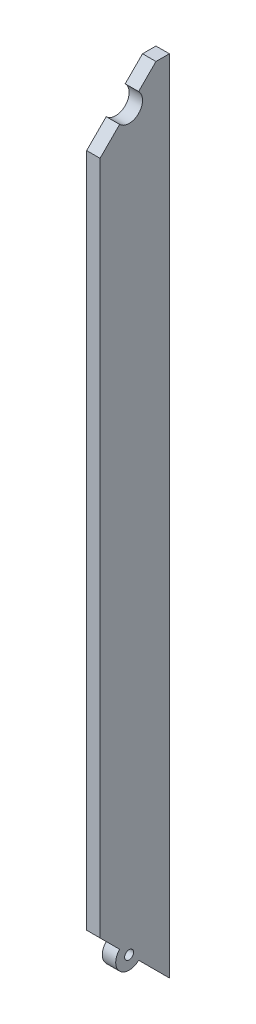
ISO-10303-21;
HEADER;
FILE_DESCRIPTION(('STEP AP214'),'2;1');
FILE_NAME('part.step','',(''),(''),'','','');
FILE_SCHEMA(('AUTOMOTIVE_DESIGN { 1 0 10303 214 1 1 1 1 }'));
ENDSEC;
DATA;
#1=APPLICATION_CONTEXT('core data for automotive mechanical design processes');
#2=APPLICATION_PROTOCOL_DEFINITION('international standard','automotive_design',2000,#1);
#3=PRODUCT_CONTEXT('',#1,'mechanical');
#4=PRODUCT('Part','Part','',(#3));
#5=PRODUCT_RELATED_PRODUCT_CATEGORY('part','',(#4));
#6=PRODUCT_DEFINITION_FORMATION('','',#4);
#7=PRODUCT_DEFINITION_CONTEXT('part definition',#1,'design');
#8=PRODUCT_DEFINITION('design','',#6,#7);
#9=PRODUCT_DEFINITION_SHAPE('','',#8);
#10=(LENGTH_UNIT() NAMED_UNIT(*) SI_UNIT(.MILLI.,.METRE.));
#11=(NAMED_UNIT(*) PLANE_ANGLE_UNIT() SI_UNIT($,.RADIAN.));
#12=(NAMED_UNIT(*) SI_UNIT($,.STERADIAN.) SOLID_ANGLE_UNIT());
#13=UNCERTAINTY_MEASURE_WITH_UNIT(LENGTH_MEASURE(1.E-05),#10,'distance_accuracy_value','');
#14=(GEOMETRIC_REPRESENTATION_CONTEXT(3) GLOBAL_UNCERTAINTY_ASSIGNED_CONTEXT((#13)) GLOBAL_UNIT_ASSIGNED_CONTEXT((#10,
#11,#12)) REPRESENTATION_CONTEXT('',''));
#15=CARTESIAN_POINT('',(0.,0.,0.));
#16=DIRECTION('',(0.,0.,1.));
#17=DIRECTION('',(1.,0.,0.));
#18=AXIS2_PLACEMENT_3D('',#15,#16,#17);
#19=CARTESIAN_POINT('',(6.,175.999999999998,176.));
#20=DIRECTION('',(0.,0.707106781186544,0.707106781186551));
#21=DIRECTION('',(0.,-0.707106781186551,0.707106781186544));
#22=AXIS2_PLACEMENT_3D('',#19,#20,#21);
#23=PLANE('',#22);
#24=DIRECTION('',(1.,0.,0.));
#25=VECTOR('',#24,1.);
#26=CARTESIAN_POINT('',(0.,335.75735931288,16.2426406871193));
#27=LINE('',#26,#25);
#28=CARTESIAN_POINT('',(0.,335.75735931288,16.2426406871193));
#29=VERTEX_POINT('',#28);
#30=CARTESIAN_POINT('',(6.,335.75735931288,16.2426406871193));
#31=VERTEX_POINT('',#30);
#32=EDGE_CURVE('E113',#29,#31,#27,.T.);
#33=ORIENTED_EDGE('',*,*,#32,.F.);
#34=DIRECTION('',(0.,0.707106781186552,-0.707106781186544));
#35=VECTOR('',#34,1.);
#36=CARTESIAN_POINT('',(0.,175.999999999998,176.));
#37=LINE('',#36,#35);
#38=CARTESIAN_POINT('',(0.,327.,25.));
#39=VERTEX_POINT('',#38);
#40=EDGE_CURVE('E117',#39,#29,#37,.T.);
#41=ORIENTED_EDGE('',*,*,#40,.F.);
#42=DIRECTION('',(-1.,0.,0.));
#43=VECTOR('',#42,1.);
#44=CARTESIAN_POINT('',(6.,327.,25.));
#45=LINE('',#44,#43);
#46=CARTESIAN_POINT('',(6.,327.,25.));
#47=VERTEX_POINT('',#46);
#48=EDGE_CURVE('E140',#47,#39,#45,.T.);
#49=ORIENTED_EDGE('',*,*,#48,.F.);
#50=DIRECTION('',(0.,0.707106781186552,-0.707106781186544));
#51=VECTOR('',#50,1.);
#52=CARTESIAN_POINT('',(6.,175.999999999998,176.));
#53=LINE('',#52,#51);
#54=EDGE_CURVE('E121',#47,#31,#53,.T.);
#55=ORIENTED_EDGE('',*,*,#54,.T.);
#56=EDGE_LOOP('',(#33,#41,#49,#55));
#57=FACE_BOUND('',#56,.T.);
#58=ADVANCED_FACE('F41',(#57),#23,.T.);
#59=CARTESIAN_POINT('',(6.,0.,0.));
#60=DIRECTION('',(0.,0.707106781186549,-0.707106781186546));
#61=DIRECTION('',(0.,0.707106781186546,0.707106781186549));
#62=AXIS2_PLACEMENT_3D('',#59,#60,#61);
#63=PLANE('',#62);
#64=DIRECTION('',(0.,-0.707106781186546,-0.707106781186549));
#65=VECTOR('',#64,1.);
#66=CARTESIAN_POINT('',(0.,0.,0.));
#67=LINE('',#66,#65);
#68=CARTESIAN_POINT('',(0.,24.9999999999999,25.));
#69=VERTEX_POINT('',#68);
#70=CARTESIAN_POINT('',(0.,16.2426406871192,16.2426406871193));
#71=VERTEX_POINT('',#70);
#72=EDGE_CURVE('E146',#69,#71,#67,.T.);
#73=ORIENTED_EDGE('',*,*,#72,.T.);
#74=DIRECTION('',(1.,0.,0.));
#75=VECTOR('',#74,1.);
#76=CARTESIAN_POINT('',(-16.9705627484771,16.2426406871193,16.2426406871193));
#77=LINE('',#76,#75);
#78=CARTESIAN_POINT('',(6.,16.2426406871192,16.2426406871193));
#79=VERTEX_POINT('',#78);
#80=EDGE_CURVE('E161',#71,#79,#77,.T.);
#81=ORIENTED_EDGE('',*,*,#80,.T.);
#82=DIRECTION('',(0.,-0.707106781186546,-0.707106781186549));
#83=VECTOR('',#82,1.);
#84=CARTESIAN_POINT('',(6.,0.,0.));
#85=LINE('',#84,#83);
#86=CARTESIAN_POINT('',(6.,24.9999999999999,25.));
#87=VERTEX_POINT('',#86);
#88=EDGE_CURVE('E154',#87,#79,#85,.T.);
#89=ORIENTED_EDGE('',*,*,#88,.F.);
#90=DIRECTION('',(-1.,0.,0.));
#91=VECTOR('',#90,1.);
#92=CARTESIAN_POINT('',(6.,24.9999999999999,25.));
#93=LINE('',#92,#91);
#94=EDGE_CURVE('E47',#87,#69,#93,.T.);
#95=ORIENTED_EDGE('',*,*,#94,.T.);
#96=EDGE_LOOP('',(#73,#81,#89,#95));
#97=FACE_BOUND('',#96,.T.);
#98=ADVANCED_FACE('F149',(#97),#63,.F.);
#99=CARTESIAN_POINT('',(6.,0.,25.));
#100=DIRECTION('',(0.,0.,1.));
#101=DIRECTION('',(0.,-1.,0.));
#102=AXIS2_PLACEMENT_3D('',#99,#100,#101);
#103=PLANE('',#102);
#104=DIRECTION('',(0.,1.,0.));
#105=VECTOR('',#104,1.);
#106=CARTESIAN_POINT('',(0.,0.,25.));
#107=LINE('',#106,#105);
#108=EDGE_CURVE('E127',#69,#39,#107,.T.);
#109=ORIENTED_EDGE('',*,*,#108,.F.);
#110=ORIENTED_EDGE('',*,*,#94,.F.);
#111=DIRECTION('',(0.,1.,0.));
#112=VECTOR('',#111,1.);
#113=CARTESIAN_POINT('',(6.,0.,25.));
#114=LINE('',#113,#112);
#115=EDGE_CURVE('E128',#87,#47,#114,.T.);
#116=ORIENTED_EDGE('',*,*,#115,.T.);
#117=ORIENTED_EDGE('',*,*,#48,.T.);
#118=EDGE_LOOP('',(#109,#110,#116,#117));
#119=FACE_BOUND('',#118,.T.);
#120=ADVANCED_FACE('F43',(#119),#103,.T.);
#121=CARTESIAN_POINT('',(6.,7.75735931288069,7.75735931288073));
#122=VERTEX_POINT('',#121);
#123=CARTESIAN_POINT('',(6.,-6.00000000000002,-6.00000000000004));
#124=VERTEX_POINT('',#123);
#125=EDGE_CURVE('E65',#122,#124,#85,.T.);
#126=ORIENTED_EDGE('',*,*,#125,.F.);
#127=DIRECTION('',(1.,0.,0.));
#128=VECTOR('',#127,1.);
#129=CARTESIAN_POINT('',(-16.9705627484771,7.7573593128807,7.75735931288073));
#130=LINE('',#129,#128);
#131=CARTESIAN_POINT('',(0.,7.75735931288069,7.75735931288073));
#132=VERTEX_POINT('',#131);
#133=EDGE_CURVE('E163',#122,#132,#130,.F.);
#134=ORIENTED_EDGE('',*,*,#133,.T.);
#135=CARTESIAN_POINT('',(0.,-6.00000000000002,-6.00000000000004));
#136=VERTEX_POINT('',#135);
#137=EDGE_CURVE('E158',#132,#136,#67,.T.);
#138=ORIENTED_EDGE('',*,*,#137,.T.);
#139=DIRECTION('',(-1.,0.,0.));
#140=VECTOR('',#139,1.);
#141=CARTESIAN_POINT('',(6.,-6.00000000000002,-6.00000000000004));
#142=LINE('',#141,#140);
#143=EDGE_CURVE('E145',#124,#136,#142,.T.);
#144=ORIENTED_EDGE('',*,*,#143,.F.);
#145=EDGE_LOOP('',(#126,#134,#138,#144));
#146=FACE_BOUND('',#145,.T.);
#147=ADVANCED_FACE('F181',(#146),#63,.F.);
#148=CARTESIAN_POINT('',(6.,0.,-6.00000000000004));
#149=DIRECTION('',(0.,0.,-1.));
#150=DIRECTION('',(0.,1.,0.));
#151=AXIS2_PLACEMENT_3D('',#148,#149,#150);
#152=PLANE('',#151);
#153=DIRECTION('',(0.,-1.,0.));
#154=VECTOR('',#153,1.);
#155=CARTESIAN_POINT('',(0.,0.,-6.00000000000004));
#156=LINE('',#155,#154);
#157=CARTESIAN_POINT('',(0.,352.,-6.));
#158=VERTEX_POINT('',#157);
#159=EDGE_CURVE('E159',#158,#136,#156,.T.);
#160=ORIENTED_EDGE('',*,*,#159,.F.);
#161=DIRECTION('',(-1.,0.,0.));
#162=VECTOR('',#161,1.);
#163=CARTESIAN_POINT('',(6.,352.,-6.));
#164=LINE('',#163,#162);
#165=CARTESIAN_POINT('',(6.,352.,-6.));
#166=VERTEX_POINT('',#165);
#167=EDGE_CURVE('E144',#166,#158,#164,.T.);
#168=ORIENTED_EDGE('',*,*,#167,.F.);
#169=DIRECTION('',(0.,-1.,0.));
#170=VECTOR('',#169,1.);
#171=CARTESIAN_POINT('',(6.,0.,-6.00000000000004));
#172=LINE('',#171,#170);
#173=EDGE_CURVE('E182',#166,#124,#172,.T.);
#174=ORIENTED_EDGE('',*,*,#173,.T.);
#175=ORIENTED_EDGE('',*,*,#143,.T.);
#176=EDGE_LOOP('',(#160,#168,#174,#175));
#177=FACE_BOUND('',#176,.T.);
#178=ADVANCED_FACE('F183',(#177),#152,.T.);
#179=CARTESIAN_POINT('',(6.,352.,0.));
#180=DIRECTION('',(0.,1.,0.));
#181=DIRECTION('',(0.,0.,1.));
#182=AXIS2_PLACEMENT_3D('',#179,#180,#181);
#183=PLANE('',#182);
#184=DIRECTION('',(0.,0.,-1.));
#185=VECTOR('',#184,1.);
#186=CARTESIAN_POINT('',(0.,352.,0.));
#187=LINE('',#186,#185);
#188=CARTESIAN_POINT('',(0.,352.,0.));
#189=VERTEX_POINT('',#188);
#190=EDGE_CURVE('E131',#189,#158,#187,.T.);
#191=ORIENTED_EDGE('',*,*,#190,.F.);
#192=DIRECTION('',(-1.,0.,0.));
#193=VECTOR('',#192,1.);
#194=CARTESIAN_POINT('',(6.,352.,0.));
#195=LINE('',#194,#193);
#196=CARTESIAN_POINT('',(6.,352.,0.));
#197=VERTEX_POINT('',#196);
#198=EDGE_CURVE('E137',#197,#189,#195,.T.);
#199=ORIENTED_EDGE('',*,*,#198,.F.);
#200=DIRECTION('',(0.,0.,-1.));
#201=VECTOR('',#200,1.);
#202=CARTESIAN_POINT('',(6.,352.,0.));
#203=LINE('',#202,#201);
#204=EDGE_CURVE('E177',#197,#166,#203,.T.);
#205=ORIENTED_EDGE('',*,*,#204,.T.);
#206=ORIENTED_EDGE('',*,*,#167,.T.);
#207=EDGE_LOOP('',(#191,#199,#205,#206));
#208=FACE_BOUND('',#207,.T.);
#209=ADVANCED_FACE('F174',(#208),#183,.T.);
#210=DIRECTION('',(1.,0.,0.));
#211=VECTOR('',#210,1.);
#212=CARTESIAN_POINT('',(0.,344.242640687119,7.75735931288075));
#213=LINE('',#212,#211);
#214=CARTESIAN_POINT('',(6.,344.242640687119,7.75735931288079));
#215=VERTEX_POINT('',#214);
#216=CARTESIAN_POINT('',(0.,344.242640687119,7.75735931288076));
#217=VERTEX_POINT('',#216);
#218=EDGE_CURVE('E57',#215,#217,#213,.F.);
#219=ORIENTED_EDGE('',*,*,#218,.F.);
#220=EDGE_CURVE('E193',#215,#197,#53,.T.);
#221=ORIENTED_EDGE('',*,*,#220,.T.);
#222=ORIENTED_EDGE('',*,*,#198,.T.);
#223=EDGE_CURVE('E129',#217,#189,#37,.T.);
#224=ORIENTED_EDGE('',*,*,#223,.F.);
#225=EDGE_LOOP('',(#219,#221,#222,#224));
#226=FACE_BOUND('',#225,.T.);
#227=ADVANCED_FACE('F196',(#226),#23,.T.);
#228=CARTESIAN_POINT('',(6.,0.,0.));
#229=DIRECTION('',(1.,0.,0.));
#230=DIRECTION('',(0.,0.,-1.));
#231=AXIS2_PLACEMENT_3D('',#228,#229,#230);
#232=PLANE('',#231);
#233=CARTESIAN_POINT('',(6.,340.,12.));
#234=DIRECTION('',(1.,0.,0.));
#235=DIRECTION('',(0.,0.,-1.));
#236=AXIS2_PLACEMENT_3D('',#233,#234,#235);
#237=CIRCLE('',#236,6.00000000000001);
#238=EDGE_CURVE('E199',#31,#215,#237,.T.);
#239=ORIENTED_EDGE('',*,*,#238,.F.);
#240=ORIENTED_EDGE('',*,*,#54,.F.);
#241=ORIENTED_EDGE('',*,*,#115,.F.);
#242=ORIENTED_EDGE('',*,*,#88,.T.);
#243=CARTESIAN_POINT('',(6.,12.,12.));
#244=DIRECTION('',(1.,0.,0.));
#245=DIRECTION('',(0.,0.,-1.));
#246=AXIS2_PLACEMENT_3D('',#243,#244,#245);
#247=CIRCLE('',#246,6.);
#248=EDGE_CURVE('E125',#79,#122,#247,.T.);
#249=ORIENTED_EDGE('',*,*,#248,.T.);
#250=ORIENTED_EDGE('',*,*,#125,.T.);
#251=ORIENTED_EDGE('',*,*,#173,.F.);
#252=ORIENTED_EDGE('',*,*,#204,.F.);
#253=ORIENTED_EDGE('',*,*,#220,.F.);
#254=EDGE_LOOP('',(#239,#240,#241,#242,#249,#250,#251,#252,#253));
#255=FACE_BOUND('',#254,.T.);
#256=CARTESIAN_POINT('',(6.,12.,12.));
#257=DIRECTION('',(1.,0.,0.));
#258=DIRECTION('',(0.,0.,-1.));
#259=AXIS2_PLACEMENT_3D('',#256,#257,#258);
#260=CIRCLE('',#259,2.);
#261=CARTESIAN_POINT('',(6.,12.,10.));
#262=VERTEX_POINT('',#261);
#263=EDGE_CURVE('E201',#262,#262,#260,.T.);
#264=ORIENTED_EDGE('',*,*,#263,.F.);
#265=EDGE_LOOP('',(#264));
#266=FACE_BOUND('',#265,.T.);
#267=ADVANCED_FACE('F198',(#255,#266),#232,.T.);
#268=CARTESIAN_POINT('',(0.,0.,0.));
#269=DIRECTION('',(1.,0.,0.));
#270=DIRECTION('',(0.,0.,-1.));
#271=AXIS2_PLACEMENT_3D('',#268,#269,#270);
#272=PLANE('',#271);
#273=CARTESIAN_POINT('',(0.,12.,12.));
#274=DIRECTION('',(1.,0.,0.));
#275=DIRECTION('',(0.,0.,-1.));
#276=AXIS2_PLACEMENT_3D('',#273,#274,#275);
#277=CIRCLE('',#276,2.);
#278=CARTESIAN_POINT('',(0.,12.,10.));
#279=VERTEX_POINT('',#278);
#280=EDGE_CURVE('E204',#279,#279,#277,.T.);
#281=ORIENTED_EDGE('',*,*,#280,.T.);
#282=EDGE_LOOP('',(#281));
#283=FACE_BOUND('',#282,.T.);
#284=ORIENTED_EDGE('',*,*,#40,.T.);
#285=CARTESIAN_POINT('',(0.,340.,12.));
#286=DIRECTION('',(1.,0.,0.));
#287=DIRECTION('',(0.,0.,-1.));
#288=AXIS2_PLACEMENT_3D('',#285,#286,#287);
#289=CIRCLE('',#288,6.00000000000001);
#290=EDGE_CURVE('E11',#29,#217,#289,.T.);
#291=ORIENTED_EDGE('',*,*,#290,.T.);
#292=ORIENTED_EDGE('',*,*,#223,.T.);
#293=ORIENTED_EDGE('',*,*,#190,.T.);
#294=ORIENTED_EDGE('',*,*,#159,.T.);
#295=ORIENTED_EDGE('',*,*,#137,.F.);
#296=CARTESIAN_POINT('',(0.,12.,12.));
#297=DIRECTION('',(1.,0.,0.));
#298=DIRECTION('',(0.,0.,-1.));
#299=AXIS2_PLACEMENT_3D('',#296,#297,#298);
#300=CIRCLE('',#299,6.);
#301=EDGE_CURVE('E156',#132,#71,#300,.F.);
#302=ORIENTED_EDGE('',*,*,#301,.T.);
#303=ORIENTED_EDGE('',*,*,#72,.F.);
#304=ORIENTED_EDGE('',*,*,#108,.T.);
#305=EDGE_LOOP('',(#284,#291,#292,#293,#294,#295,#302,#303,#304));
#306=FACE_BOUND('',#305,.T.);
#307=ADVANCED_FACE('F124',(#283,#306),#272,.F.);
#308=CARTESIAN_POINT('',(-16.9705627484771,12.,12.));
#309=DIRECTION('',(1.,0.,0.));
#310=DIRECTION('',(0.,0.,-1.));
#311=AXIS2_PLACEMENT_3D('',#308,#309,#310);
#312=CYLINDRICAL_SURFACE('',#311,6.);
#313=ORIENTED_EDGE('',*,*,#80,.F.);
#314=ORIENTED_EDGE('',*,*,#301,.F.);
#315=ORIENTED_EDGE('',*,*,#133,.F.);
#316=ORIENTED_EDGE('',*,*,#248,.F.);
#317=EDGE_LOOP('',(#313,#314,#315,#316));
#318=FACE_BOUND('',#317,.T.);
#319=ADVANCED_FACE('F186',(#318),#312,.T.);
#320=CARTESIAN_POINT('',(0.,12.,12.));
#321=DIRECTION('',(1.,0.,0.));
#322=DIRECTION('',(0.,0.,-1.));
#323=AXIS2_PLACEMENT_3D('',#320,#321,#322);
#324=CYLINDRICAL_SURFACE('',#323,2.);
#325=ORIENTED_EDGE('',*,*,#280,.F.);
#326=EDGE_LOOP('',(#325));
#327=FACE_BOUND('',#326,.T.);
#328=ORIENTED_EDGE('',*,*,#263,.T.);
#329=EDGE_LOOP('',(#328));
#330=FACE_BOUND('',#329,.T.);
#331=ADVANCED_FACE('F211',(#327,#330),#324,.F.);
#332=CARTESIAN_POINT('',(0.,340.,12.));
#333=DIRECTION('',(1.,0.,0.));
#334=DIRECTION('',(0.,0.,-1.));
#335=AXIS2_PLACEMENT_3D('',#332,#333,#334);
#336=CYLINDRICAL_SURFACE('',#335,6.00000000000001);
#337=ORIENTED_EDGE('',*,*,#32,.T.);
#338=ORIENTED_EDGE('',*,*,#238,.T.);
#339=ORIENTED_EDGE('',*,*,#218,.T.);
#340=ORIENTED_EDGE('',*,*,#290,.F.);
#341=EDGE_LOOP('',(#337,#338,#339,#340));
#342=FACE_BOUND('',#341,.T.);
#343=ADVANCED_FACE('F109',(#342),#336,.F.);
#344=CLOSED_SHELL('',(#58,#98,#120,#147,#178,#209,#227,#267,#307,#319,#331,#343));
#345=MANIFOLD_SOLID_BREP('B2',#344);
#346=ADVANCED_BREP_SHAPE_REPRESENTATION('',(#18,#345),#14);
#347=SHAPE_DEFINITION_REPRESENTATION(#9,#346);
ENDSEC;
END-ISO-10303-21;
